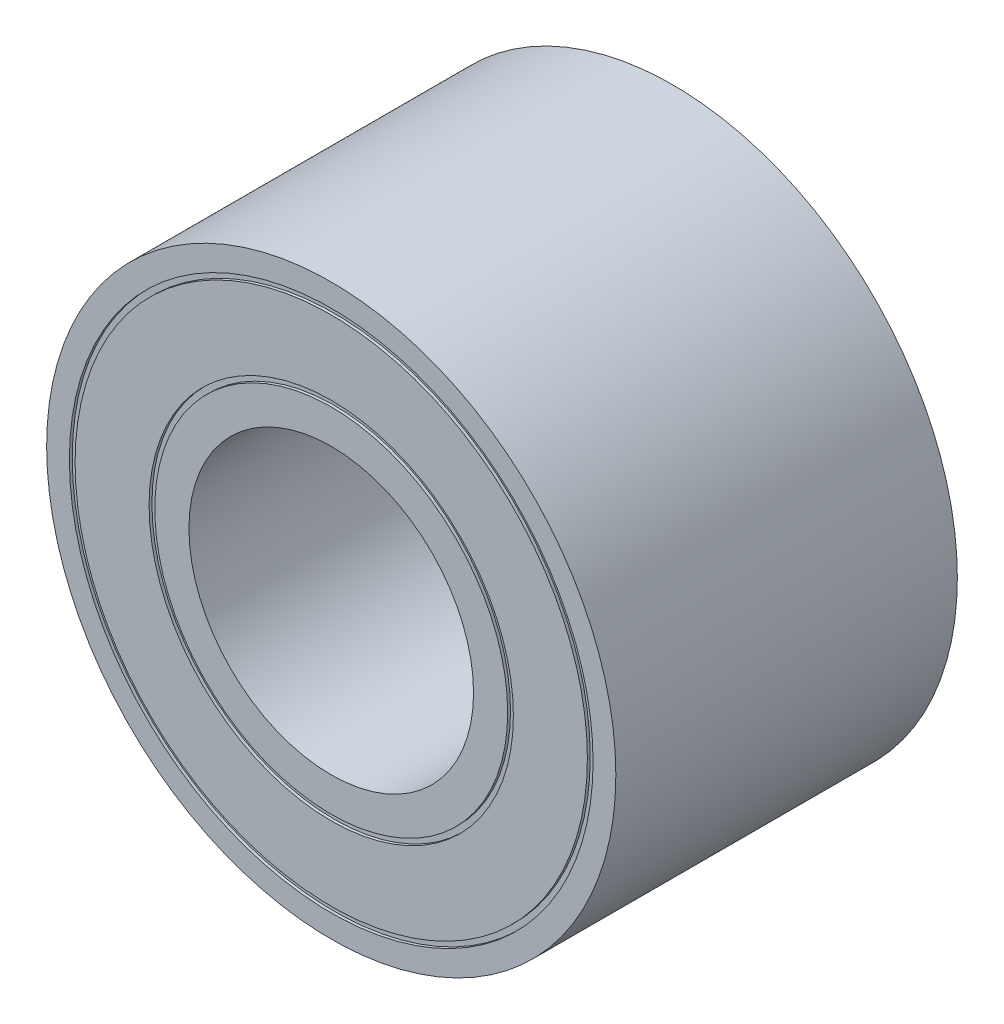
ISO-10303-21;
HEADER;
FILE_DESCRIPTION(('STEP AP214'),'2;1');
FILE_NAME('part.step','',(''),(''),'','','');
FILE_SCHEMA(('AUTOMOTIVE_DESIGN { 1 0 10303 214 1 1 1 1 }'));
ENDSEC;
DATA;
#1=APPLICATION_CONTEXT('core data for automotive mechanical design processes');
#2=APPLICATION_PROTOCOL_DEFINITION('international standard','automotive_design',2000,#1);
#3=PRODUCT_CONTEXT('',#1,'mechanical');
#4=PRODUCT('Part','Part','',(#3));
#5=PRODUCT_RELATED_PRODUCT_CATEGORY('part','',(#4));
#6=PRODUCT_DEFINITION_FORMATION('','',#4);
#7=PRODUCT_DEFINITION_CONTEXT('part definition',#1,'design');
#8=PRODUCT_DEFINITION('design','',#6,#7);
#9=PRODUCT_DEFINITION_SHAPE('','',#8);
#10=(LENGTH_UNIT() NAMED_UNIT(*) SI_UNIT(.MILLI.,.METRE.));
#11=(NAMED_UNIT(*) PLANE_ANGLE_UNIT() SI_UNIT($,.RADIAN.));
#12=(NAMED_UNIT(*) SI_UNIT($,.STERADIAN.) SOLID_ANGLE_UNIT());
#13=UNCERTAINTY_MEASURE_WITH_UNIT(LENGTH_MEASURE(1.E-05),#10,'distance_accuracy_value','');
#14=(GEOMETRIC_REPRESENTATION_CONTEXT(3) GLOBAL_UNCERTAINTY_ASSIGNED_CONTEXT((#13)) GLOBAL_UNIT_ASSIGNED_CONTEXT((#10,
#11,#12)) REPRESENTATION_CONTEXT('',''));
#15=CARTESIAN_POINT('',(0.,0.,0.));
#16=DIRECTION('',(0.,0.,1.));
#17=DIRECTION('',(1.,0.,0.));
#18=AXIS2_PLACEMENT_3D('',#15,#16,#17);
#19=CARTESIAN_POINT('',(0.,0.,-15.));
#20=DIRECTION('',(0.,0.,1.));
#21=DIRECTION('',(1.,0.,0.));
#22=AXIS2_PLACEMENT_3D('',#19,#20,#21);
#23=PLANE('',#22);
#24=CARTESIAN_POINT('',(0.,0.,-15.));
#25=DIRECTION('',(0.,0.,1.));
#26=DIRECTION('',(1.,0.,0.));
#27=AXIS2_PLACEMENT_3D('',#24,#25,#26);
#28=CIRCLE('',#27,12.5);
#29=CARTESIAN_POINT('',(12.5,0.,-15.));
#30=VERTEX_POINT('',#29);
#31=EDGE_CURVE('E70',#30,#30,#28,.T.);
#32=ORIENTED_EDGE('',*,*,#31,.T.);
#33=EDGE_LOOP('',(#32));
#34=FACE_BOUND('',#33,.T.);
#35=CARTESIAN_POINT('',(0.,0.,-15.));
#36=DIRECTION('',(0.,0.,1.));
#37=DIRECTION('',(1.,0.,0.));
#38=AXIS2_PLACEMENT_3D('',#35,#36,#37);
#39=CIRCLE('',#38,15.5);
#40=CARTESIAN_POINT('',(15.5,0.,-15.));
#41=VERTEX_POINT('',#40);
#42=EDGE_CURVE('E104',#41,#41,#39,.T.);
#43=ORIENTED_EDGE('',*,*,#42,.F.);
#44=EDGE_LOOP('',(#43));
#45=FACE_BOUND('',#44,.T.);
#46=ADVANCED_FACE('F57',(#34,#45),#23,.F.);
#47=CARTESIAN_POINT('',(0.,0.,15.));
#48=DIRECTION('',(0.,0.,1.));
#49=DIRECTION('',(1.,0.,0.));
#50=AXIS2_PLACEMENT_3D('',#47,#48,#49);
#51=PLANE('',#50);
#52=CARTESIAN_POINT('',(0.,0.,15.));
#53=DIRECTION('',(0.,0.,1.));
#54=DIRECTION('',(1.,0.,0.));
#55=AXIS2_PLACEMENT_3D('',#52,#53,#54);
#56=CIRCLE('',#55,12.5);
#57=CARTESIAN_POINT('',(12.5,0.,15.));
#58=VERTEX_POINT('',#57);
#59=EDGE_CURVE('E68',#58,#58,#56,.T.);
#60=ORIENTED_EDGE('',*,*,#59,.F.);
#61=EDGE_LOOP('',(#60));
#62=FACE_BOUND('',#61,.T.);
#63=CARTESIAN_POINT('',(0.,0.,15.));
#64=DIRECTION('',(0.,0.,1.));
#65=DIRECTION('',(1.,0.,0.));
#66=AXIS2_PLACEMENT_3D('',#63,#64,#65);
#67=CIRCLE('',#66,15.5);
#68=CARTESIAN_POINT('',(15.5,0.,15.));
#69=VERTEX_POINT('',#68);
#70=EDGE_CURVE('E80',#69,#69,#67,.T.);
#71=ORIENTED_EDGE('',*,*,#70,.T.);
#72=EDGE_LOOP('',(#71));
#73=FACE_BOUND('',#72,.T.);
#74=ADVANCED_FACE('F145',(#62,#73),#51,.T.);
#75=CARTESIAN_POINT('',(0.,0.,15.));
#76=DIRECTION('',(0.,0.,1.));
#77=DIRECTION('',(1.,0.,0.));
#78=AXIS2_PLACEMENT_3D('',#75,#76,#77);
#79=CIRCLE('',#78,23.);
#80=CARTESIAN_POINT('',(23.,0.,15.));
#81=VERTEX_POINT('',#80);
#82=EDGE_CURVE('E88',#81,#81,#79,.T.);
#83=ORIENTED_EDGE('',*,*,#82,.F.);
#84=EDGE_LOOP('',(#83));
#85=FACE_BOUND('',#84,.T.);
#86=CARTESIAN_POINT('',(0.,0.,15.));
#87=DIRECTION('',(0.,0.,1.));
#88=DIRECTION('',(1.,0.,0.));
#89=AXIS2_PLACEMENT_3D('',#86,#87,#88);
#90=CIRCLE('',#89,25.);
#91=CARTESIAN_POINT('',(25.,0.,15.));
#92=VERTEX_POINT('',#91);
#93=EDGE_CURVE('E13',#92,#92,#90,.T.);
#94=ORIENTED_EDGE('',*,*,#93,.T.);
#95=EDGE_LOOP('',(#94));
#96=FACE_BOUND('',#95,.T.);
#97=ADVANCED_FACE('F148',(#85,#96),#51,.T.);
#98=CARTESIAN_POINT('',(0.,0.,-15.));
#99=DIRECTION('',(0.,0.,1.));
#100=DIRECTION('',(1.,0.,0.));
#101=AXIS2_PLACEMENT_3D('',#98,#99,#100);
#102=CIRCLE('',#101,23.);
#103=CARTESIAN_POINT('',(23.,0.,-15.));
#104=VERTEX_POINT('',#103);
#105=EDGE_CURVE('E112',#104,#104,#102,.T.);
#106=ORIENTED_EDGE('',*,*,#105,.T.);
#107=EDGE_LOOP('',(#106));
#108=FACE_BOUND('',#107,.T.);
#109=CARTESIAN_POINT('',(0.,0.,-15.));
#110=DIRECTION('',(0.,0.,1.));
#111=DIRECTION('',(1.,0.,0.));
#112=AXIS2_PLACEMENT_3D('',#109,#110,#111);
#113=CIRCLE('',#112,25.);
#114=CARTESIAN_POINT('',(25.,0.,-15.));
#115=VERTEX_POINT('',#114);
#116=EDGE_CURVE('E61',#115,#115,#113,.T.);
#117=ORIENTED_EDGE('',*,*,#116,.F.);
#118=EDGE_LOOP('',(#117));
#119=FACE_BOUND('',#118,.T.);
#120=ADVANCED_FACE('F138',(#108,#119),#23,.F.);
#121=CARTESIAN_POINT('',(0.,0.,15.));
#122=DIRECTION('',(0.,0.,-1.));
#123=DIRECTION('',(-1.,0.,0.));
#124=AXIS2_PLACEMENT_3D('',#121,#122,#123);
#125=CYLINDRICAL_SURFACE('',#124,25.);
#126=ORIENTED_EDGE('',*,*,#93,.F.);
#127=EDGE_LOOP('',(#126));
#128=FACE_BOUND('',#127,.T.);
#129=ORIENTED_EDGE('',*,*,#116,.T.);
#130=EDGE_LOOP('',(#129));
#131=FACE_BOUND('',#130,.T.);
#132=ADVANCED_FACE('F59',(#128,#131),#125,.T.);
#133=CARTESIAN_POINT('',(0.,0.,15.));
#134=DIRECTION('',(0.,0.,-1.));
#135=DIRECTION('',(-1.,0.,0.));
#136=AXIS2_PLACEMENT_3D('',#133,#134,#135);
#137=CYLINDRICAL_SURFACE('',#136,12.5);
#138=ORIENTED_EDGE('',*,*,#59,.T.);
#139=EDGE_LOOP('',(#138));
#140=FACE_BOUND('',#139,.T.);
#141=ORIENTED_EDGE('',*,*,#31,.F.);
#142=EDGE_LOOP('',(#141));
#143=FACE_BOUND('',#142,.T.);
#144=ADVANCED_FACE('F154',(#140,#143),#137,.F.);
#145=CARTESIAN_POINT('',(0.,0.,14.75));
#146=DIRECTION('',(0.,0.,1.));
#147=DIRECTION('',(1.,0.,0.));
#148=AXIS2_PLACEMENT_3D('',#145,#146,#147);
#149=CYLINDRICAL_SURFACE('',#148,15.5);
#150=CARTESIAN_POINT('',(0.,0.,14.75));
#151=DIRECTION('',(0.,0.,1.));
#152=DIRECTION('',(1.,0.,0.));
#153=AXIS2_PLACEMENT_3D('',#150,#151,#152);
#154=CIRCLE('',#153,15.5);
#155=CARTESIAN_POINT('',(15.5,0.,14.75));
#156=VERTEX_POINT('',#155);
#157=EDGE_CURVE('E79',#156,#156,#154,.T.);
#158=ORIENTED_EDGE('',*,*,#157,.T.);
#159=EDGE_LOOP('',(#158));
#160=FACE_BOUND('',#159,.T.);
#161=ORIENTED_EDGE('',*,*,#70,.F.);
#162=EDGE_LOOP('',(#161));
#163=FACE_BOUND('',#162,.T.);
#164=ADVANCED_FACE('F199',(#160,#163),#149,.T.);
#165=CARTESIAN_POINT('',(0.,0.,14.75));
#166=DIRECTION('',(0.,0.,1.));
#167=DIRECTION('',(1.,0.,0.));
#168=AXIS2_PLACEMENT_3D('',#165,#166,#167);
#169=CYLINDRICAL_SURFACE('',#168,16.);
#170=CARTESIAN_POINT('',(0.,0.,14.75));
#171=DIRECTION('',(0.,0.,1.));
#172=DIRECTION('',(1.,0.,0.));
#173=AXIS2_PLACEMENT_3D('',#170,#171,#172);
#174=CIRCLE('',#173,16.);
#175=CARTESIAN_POINT('',(16.,0.,14.75));
#176=VERTEX_POINT('',#175);
#177=EDGE_CURVE('E73',#176,#176,#174,.T.);
#178=ORIENTED_EDGE('',*,*,#177,.F.);
#179=EDGE_LOOP('',(#178));
#180=FACE_BOUND('',#179,.T.);
#181=CARTESIAN_POINT('',(0.,0.,15.));
#182=DIRECTION('',(0.,0.,1.));
#183=DIRECTION('',(1.,0.,0.));
#184=AXIS2_PLACEMENT_3D('',#181,#182,#183);
#185=CIRCLE('',#184,16.);
#186=CARTESIAN_POINT('',(16.,0.,15.));
#187=VERTEX_POINT('',#186);
#188=EDGE_CURVE('E76',#187,#187,#185,.T.);
#189=ORIENTED_EDGE('',*,*,#188,.T.);
#190=EDGE_LOOP('',(#189));
#191=FACE_BOUND('',#190,.T.);
#192=ADVANCED_FACE('F195',(#180,#191),#169,.F.);
#193=CARTESIAN_POINT('',(0.,0.,14.75));
#194=DIRECTION('',(0.,0.,1.));
#195=DIRECTION('',(1.,0.,0.));
#196=AXIS2_PLACEMENT_3D('',#193,#194,#195);
#197=PLANE('',#196);
#198=ORIENTED_EDGE('',*,*,#157,.F.);
#199=EDGE_LOOP('',(#198));
#200=FACE_BOUND('',#199,.T.);
#201=ORIENTED_EDGE('',*,*,#177,.T.);
#202=EDGE_LOOP('',(#201));
#203=FACE_BOUND('',#202,.T.);
#204=ADVANCED_FACE('F191',(#200,#203),#197,.T.);
#205=CARTESIAN_POINT('',(0.,0.,14.75));
#206=DIRECTION('',(0.,0.,1.));
#207=DIRECTION('',(1.,0.,0.));
#208=AXIS2_PLACEMENT_3D('',#205,#206,#207);
#209=CYLINDRICAL_SURFACE('',#208,22.5);
#210=CARTESIAN_POINT('',(0.,0.,14.75));
#211=DIRECTION('',(0.,0.,1.));
#212=DIRECTION('',(1.,0.,0.));
#213=AXIS2_PLACEMENT_3D('',#210,#211,#212);
#214=CIRCLE('',#213,22.5);
#215=CARTESIAN_POINT('',(22.5,0.,14.75));
#216=VERTEX_POINT('',#215);
#217=EDGE_CURVE('E91',#216,#216,#214,.T.);
#218=ORIENTED_EDGE('',*,*,#217,.T.);
#219=EDGE_LOOP('',(#218));
#220=FACE_BOUND('',#219,.T.);
#221=CARTESIAN_POINT('',(0.,0.,15.));
#222=DIRECTION('',(0.,0.,1.));
#223=DIRECTION('',(1.,0.,0.));
#224=AXIS2_PLACEMENT_3D('',#221,#222,#223);
#225=CIRCLE('',#224,22.5);
#226=CARTESIAN_POINT('',(22.5,0.,15.));
#227=VERTEX_POINT('',#226);
#228=EDGE_CURVE('E92',#227,#227,#225,.T.);
#229=ORIENTED_EDGE('',*,*,#228,.F.);
#230=EDGE_LOOP('',(#229));
#231=FACE_BOUND('',#230,.T.);
#232=ADVANCED_FACE('F187',(#220,#231),#209,.T.);
#233=CARTESIAN_POINT('',(0.,0.,14.75));
#234=DIRECTION('',(0.,0.,1.));
#235=DIRECTION('',(1.,0.,0.));
#236=AXIS2_PLACEMENT_3D('',#233,#234,#235);
#237=CYLINDRICAL_SURFACE('',#236,23.);
#238=CARTESIAN_POINT('',(0.,0.,14.75));
#239=DIRECTION('',(0.,0.,1.));
#240=DIRECTION('',(1.,0.,0.));
#241=AXIS2_PLACEMENT_3D('',#238,#239,#240);
#242=CIRCLE('',#241,23.);
#243=CARTESIAN_POINT('',(23.,0.,14.75));
#244=VERTEX_POINT('',#243);
#245=EDGE_CURVE('E83',#244,#244,#242,.T.);
#246=ORIENTED_EDGE('',*,*,#245,.F.);
#247=EDGE_LOOP('',(#246));
#248=FACE_BOUND('',#247,.T.);
#249=ORIENTED_EDGE('',*,*,#82,.T.);
#250=EDGE_LOOP('',(#249));
#251=FACE_BOUND('',#250,.T.);
#252=ADVANCED_FACE('F183',(#248,#251),#237,.F.);
#253=CARTESIAN_POINT('',(0.,0.,14.75));
#254=DIRECTION('',(0.,0.,1.));
#255=DIRECTION('',(1.,0.,0.));
#256=AXIS2_PLACEMENT_3D('',#253,#254,#255);
#257=PLANE('',#256);
#258=ORIENTED_EDGE('',*,*,#217,.F.);
#259=EDGE_LOOP('',(#258));
#260=FACE_BOUND('',#259,.T.);
#261=ORIENTED_EDGE('',*,*,#245,.T.);
#262=EDGE_LOOP('',(#261));
#263=FACE_BOUND('',#262,.T.);
#264=ADVANCED_FACE('F180',(#260,#263),#257,.T.);
#265=ORIENTED_EDGE('',*,*,#188,.F.);
#266=EDGE_LOOP('',(#265));
#267=FACE_BOUND('',#266,.T.);
#268=ORIENTED_EDGE('',*,*,#228,.T.);
#269=EDGE_LOOP('',(#268));
#270=FACE_BOUND('',#269,.T.);
#271=ADVANCED_FACE('F157',(#267,#270),#51,.T.);
#272=CARTESIAN_POINT('',(0.,0.,-14.75));
#273=DIRECTION('',(0.,0.,-1.));
#274=DIRECTION('',(-1.,0.,0.));
#275=AXIS2_PLACEMENT_3D('',#272,#273,#274);
#276=CYLINDRICAL_SURFACE('',#275,15.5);
#277=CARTESIAN_POINT('',(0.,0.,-14.75));
#278=DIRECTION('',(0.,0.,1.));
#279=DIRECTION('',(1.,0.,0.));
#280=AXIS2_PLACEMENT_3D('',#277,#278,#279);
#281=CIRCLE('',#280,15.5);
#282=CARTESIAN_POINT('',(15.5,0.,-14.75));
#283=VERTEX_POINT('',#282);
#284=EDGE_CURVE('E103',#283,#283,#281,.T.);
#285=ORIENTED_EDGE('',*,*,#284,.F.);
#286=EDGE_LOOP('',(#285));
#287=FACE_BOUND('',#286,.T.);
#288=ORIENTED_EDGE('',*,*,#42,.T.);
#289=EDGE_LOOP('',(#288));
#290=FACE_BOUND('',#289,.T.);
#291=ADVANCED_FACE('F175',(#287,#290),#276,.T.);
#292=CARTESIAN_POINT('',(0.,0.,-14.75));
#293=DIRECTION('',(0.,0.,-1.));
#294=DIRECTION('',(-1.,0.,0.));
#295=AXIS2_PLACEMENT_3D('',#292,#293,#294);
#296=CYLINDRICAL_SURFACE('',#295,16.);
#297=CARTESIAN_POINT('',(0.,0.,-14.75));
#298=DIRECTION('',(0.,0.,1.));
#299=DIRECTION('',(1.,0.,0.));
#300=AXIS2_PLACEMENT_3D('',#297,#298,#299);
#301=CIRCLE('',#300,16.);
#302=CARTESIAN_POINT('',(16.,0.,-14.75));
#303=VERTEX_POINT('',#302);
#304=EDGE_CURVE('E95',#303,#303,#301,.T.);
#305=ORIENTED_EDGE('',*,*,#304,.T.);
#306=EDGE_LOOP('',(#305));
#307=FACE_BOUND('',#306,.T.);
#308=CARTESIAN_POINT('',(0.,0.,-15.));
#309=DIRECTION('',(0.,0.,1.));
#310=DIRECTION('',(1.,0.,0.));
#311=AXIS2_PLACEMENT_3D('',#308,#309,#310);
#312=CIRCLE('',#311,16.);
#313=CARTESIAN_POINT('',(16.,0.,-15.));
#314=VERTEX_POINT('',#313);
#315=EDGE_CURVE('E100',#314,#314,#312,.T.);
#316=ORIENTED_EDGE('',*,*,#315,.F.);
#317=EDGE_LOOP('',(#316));
#318=FACE_BOUND('',#317,.T.);
#319=ADVANCED_FACE('F171',(#307,#318),#296,.F.);
#320=CARTESIAN_POINT('',(0.,0.,-14.75));
#321=DIRECTION('',(0.,0.,-1.));
#322=DIRECTION('',(1.,0.,0.));
#323=AXIS2_PLACEMENT_3D('',#320,#321,#322);
#324=PLANE('',#323);
#325=ORIENTED_EDGE('',*,*,#284,.T.);
#326=EDGE_LOOP('',(#325));
#327=FACE_BOUND('',#326,.T.);
#328=ORIENTED_EDGE('',*,*,#304,.F.);
#329=EDGE_LOOP('',(#328));
#330=FACE_BOUND('',#329,.T.);
#331=ADVANCED_FACE('F131',(#327,#330),#324,.T.);
#332=CARTESIAN_POINT('',(0.,0.,-14.75));
#333=DIRECTION('',(0.,0.,-1.));
#334=DIRECTION('',(-1.,0.,0.));
#335=AXIS2_PLACEMENT_3D('',#332,#333,#334);
#336=CYLINDRICAL_SURFACE('',#335,22.5);
#337=CARTESIAN_POINT('',(0.,0.,-14.75));
#338=DIRECTION('',(0.,0.,1.));
#339=DIRECTION('',(1.,0.,0.));
#340=AXIS2_PLACEMENT_3D('',#337,#338,#339);
#341=CIRCLE('',#340,22.5);
#342=CARTESIAN_POINT('',(22.5,0.,-14.75));
#343=VERTEX_POINT('',#342);
#344=EDGE_CURVE('E115',#343,#343,#341,.T.);
#345=ORIENTED_EDGE('',*,*,#344,.F.);
#346=EDGE_LOOP('',(#345));
#347=FACE_BOUND('',#346,.T.);
#348=CARTESIAN_POINT('',(0.,0.,-15.));
#349=DIRECTION('',(0.,0.,1.));
#350=DIRECTION('',(1.,0.,0.));
#351=AXIS2_PLACEMENT_3D('',#348,#349,#350);
#352=CIRCLE('',#351,22.5);
#353=CARTESIAN_POINT('',(22.5,0.,-15.));
#354=VERTEX_POINT('',#353);
#355=EDGE_CURVE('E116',#354,#354,#352,.T.);
#356=ORIENTED_EDGE('',*,*,#355,.T.);
#357=EDGE_LOOP('',(#356));
#358=FACE_BOUND('',#357,.T.);
#359=ADVANCED_FACE('F127',(#347,#358),#336,.T.);
#360=CARTESIAN_POINT('',(0.,0.,-14.75));
#361=DIRECTION('',(0.,0.,-1.));
#362=DIRECTION('',(-1.,0.,0.));
#363=AXIS2_PLACEMENT_3D('',#360,#361,#362);
#364=CYLINDRICAL_SURFACE('',#363,23.);
#365=CARTESIAN_POINT('',(0.,0.,-14.75));
#366=DIRECTION('',(0.,0.,1.));
#367=DIRECTION('',(1.,0.,0.));
#368=AXIS2_PLACEMENT_3D('',#365,#366,#367);
#369=CIRCLE('',#368,23.);
#370=CARTESIAN_POINT('',(23.,0.,-14.75));
#371=VERTEX_POINT('',#370);
#372=EDGE_CURVE('E107',#371,#371,#369,.T.);
#373=ORIENTED_EDGE('',*,*,#372,.T.);
#374=EDGE_LOOP('',(#373));
#375=FACE_BOUND('',#374,.T.);
#376=ORIENTED_EDGE('',*,*,#105,.F.);
#377=EDGE_LOOP('',(#376));
#378=FACE_BOUND('',#377,.T.);
#379=ADVANCED_FACE('F130',(#375,#378),#364,.F.);
#380=CARTESIAN_POINT('',(0.,0.,-14.75));
#381=DIRECTION('',(0.,0.,-1.));
#382=DIRECTION('',(1.,0.,0.));
#383=AXIS2_PLACEMENT_3D('',#380,#381,#382);
#384=PLANE('',#383);
#385=ORIENTED_EDGE('',*,*,#344,.T.);
#386=EDGE_LOOP('',(#385));
#387=FACE_BOUND('',#386,.T.);
#388=ORIENTED_EDGE('',*,*,#372,.F.);
#389=EDGE_LOOP('',(#388));
#390=FACE_BOUND('',#389,.T.);
#391=ADVANCED_FACE('F124',(#387,#390),#384,.T.);
#392=ORIENTED_EDGE('',*,*,#315,.T.);
#393=EDGE_LOOP('',(#392));
#394=FACE_BOUND('',#393,.T.);
#395=ORIENTED_EDGE('',*,*,#355,.F.);
#396=EDGE_LOOP('',(#395));
#397=FACE_BOUND('',#396,.T.);
#398=ADVANCED_FACE('F135',(#394,#397),#23,.F.);
#399=CLOSED_SHELL('',(#46,#74,#97,#120,#132,#144,#164,#192,#204,#232,#252,#264,#271,#291,#319,
#331,#359,#379,#391,#398));
#400=MANIFOLD_SOLID_BREP('B2',#399);
#401=ADVANCED_BREP_SHAPE_REPRESENTATION('',(#18,#400),#14);
#402=SHAPE_DEFINITION_REPRESENTATION(#9,#401);
ENDSEC;
END-ISO-10303-21;
